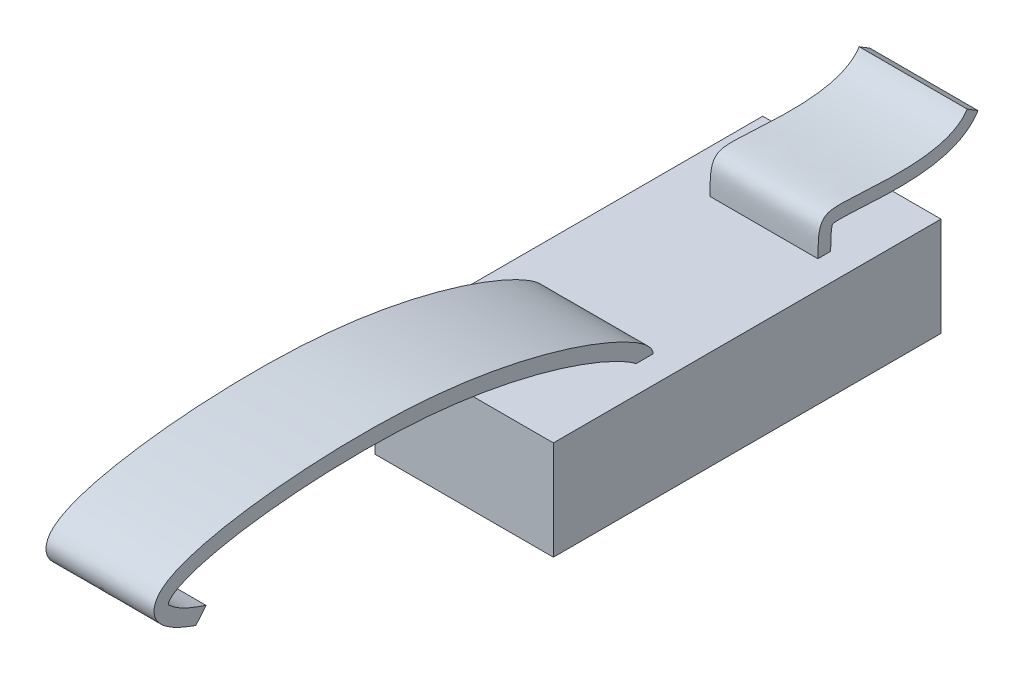
ISO-10303-21;
HEADER;
FILE_DESCRIPTION(('STEP AP214'),'2;1');
FILE_NAME('part.step','',(''),(''),'','','');
FILE_SCHEMA(('AUTOMOTIVE_DESIGN { 1 0 10303 214 1 1 1 1 }'));
ENDSEC;
DATA;
#1=APPLICATION_CONTEXT('core data for automotive mechanical design processes');
#2=APPLICATION_PROTOCOL_DEFINITION('international standard','automotive_design',2000,#1);
#3=PRODUCT_CONTEXT('',#1,'mechanical');
#4=PRODUCT('Part','Part','',(#3));
#5=PRODUCT_RELATED_PRODUCT_CATEGORY('part','',(#4));
#6=PRODUCT_DEFINITION_FORMATION('','',#4);
#7=PRODUCT_DEFINITION_CONTEXT('part definition',#1,'design');
#8=PRODUCT_DEFINITION('design','',#6,#7);
#9=PRODUCT_DEFINITION_SHAPE('','',#8);
#10=(LENGTH_UNIT() NAMED_UNIT(*) SI_UNIT(.MILLI.,.METRE.));
#11=(NAMED_UNIT(*) PLANE_ANGLE_UNIT() SI_UNIT($,.RADIAN.));
#12=(NAMED_UNIT(*) SI_UNIT($,.STERADIAN.) SOLID_ANGLE_UNIT());
#13=UNCERTAINTY_MEASURE_WITH_UNIT(LENGTH_MEASURE(1.E-05),#10,'distance_accuracy_value','');
#14=(GEOMETRIC_REPRESENTATION_CONTEXT(3) GLOBAL_UNCERTAINTY_ASSIGNED_CONTEXT((#13)) GLOBAL_UNIT_ASSIGNED_CONTEXT((#10,
#11,#12)) REPRESENTATION_CONTEXT('',''));
#15=CARTESIAN_POINT('',(0.,0.,0.));
#16=DIRECTION('',(0.,0.,1.));
#17=DIRECTION('',(1.,0.,0.));
#18=AXIS2_PLACEMENT_3D('',#15,#16,#17);
#19=CARTESIAN_POINT('',(-5.36962025316455,7.,-6.77848101265823));
#20=DIRECTION('',(1.,0.,0.));
#21=DIRECTION('',(0.,0.,-1.));
#22=AXIS2_PLACEMENT_3D('',#19,#20,#21);
#23=PLANE('',#22);
#24=DIRECTION('',(0.,0.,1.));
#25=VECTOR('',#24,1.);
#26=CARTESIAN_POINT('',(-5.36962025316455,0.,-6.77848101265823));
#27=LINE('',#26,#25);
#28=CARTESIAN_POINT('',(-5.36962025316455,0.,-6.77848101265823));
#29=VERTEX_POINT('',#28);
#30=CARTESIAN_POINT('',(-5.36962025316455,0.,20.6215189873418));
#31=VERTEX_POINT('',#30);
#32=EDGE_CURVE('E240',#29,#31,#27,.T.);
#33=ORIENTED_EDGE('',*,*,#32,.T.);
#34=DIRECTION('',(0.,-1.,0.));
#35=VECTOR('',#34,1.);
#36=CARTESIAN_POINT('',(-5.36962025316455,7.,20.6215189873418));
#37=LINE('',#36,#35);
#38=CARTESIAN_POINT('',(-5.36962025316455,7.,20.6215189873418));
#39=VERTEX_POINT('',#38);
#40=EDGE_CURVE('E267',#39,#31,#37,.T.);
#41=ORIENTED_EDGE('',*,*,#40,.F.);
#42=DIRECTION('',(0.,0.,1.));
#43=VECTOR('',#42,1.);
#44=CARTESIAN_POINT('',(-5.36962025316455,7.,-6.77848101265823));
#45=LINE('',#44,#43);
#46=CARTESIAN_POINT('',(-5.36962025316455,7.,-6.77848101265823));
#47=VERTEX_POINT('',#46);
#48=EDGE_CURVE('E241',#47,#39,#45,.T.);
#49=ORIENTED_EDGE('',*,*,#48,.F.);
#50=DIRECTION('',(0.,-1.,0.));
#51=VECTOR('',#50,1.);
#52=CARTESIAN_POINT('',(-5.36962025316455,7.,-6.77848101265823));
#53=LINE('',#52,#51);
#54=EDGE_CURVE('E251',#47,#29,#53,.T.);
#55=ORIENTED_EDGE('',*,*,#54,.T.);
#56=EDGE_LOOP('',(#33,#41,#49,#55));
#57=FACE_BOUND('',#56,.T.);
#58=ADVANCED_FACE('F33',(#57),#23,.F.);
#59=CARTESIAN_POINT('',(-5.36962025316455,7.,20.6215189873418));
#60=DIRECTION('',(0.,0.,-1.));
#61=DIRECTION('',(-1.,0.,0.));
#62=AXIS2_PLACEMENT_3D('',#59,#60,#61);
#63=PLANE('',#62);
#64=DIRECTION('',(1.,0.,0.));
#65=VECTOR('',#64,1.);
#66=CARTESIAN_POINT('',(-5.36962025316455,0.,20.6215189873418));
#67=LINE('',#66,#65);
#68=CARTESIAN_POINT('',(7.23037974683545,0.,20.6215189873418));
#69=VERTEX_POINT('',#68);
#70=EDGE_CURVE('E254',#31,#69,#67,.T.);
#71=ORIENTED_EDGE('',*,*,#70,.T.);
#72=DIRECTION('',(0.,-1.,0.));
#73=VECTOR('',#72,1.);
#74=CARTESIAN_POINT('',(7.23037974683545,7.,20.6215189873418));
#75=LINE('',#74,#73);
#76=CARTESIAN_POINT('',(7.23037974683545,7.,20.6215189873418));
#77=VERTEX_POINT('',#76);
#78=EDGE_CURVE('E264',#77,#69,#75,.T.);
#79=ORIENTED_EDGE('',*,*,#78,.F.);
#80=DIRECTION('',(1.,0.,0.));
#81=VECTOR('',#80,1.);
#82=CARTESIAN_POINT('',(-5.36962025316455,7.,20.6215189873418));
#83=LINE('',#82,#81);
#84=EDGE_CURVE('E244',#39,#77,#83,.T.);
#85=ORIENTED_EDGE('',*,*,#84,.F.);
#86=ORIENTED_EDGE('',*,*,#40,.T.);
#87=EDGE_LOOP('',(#71,#79,#85,#86));
#88=FACE_BOUND('',#87,.T.);
#89=ADVANCED_FACE('F304',(#88),#63,.F.);
#90=CARTESIAN_POINT('',(7.23037974683545,7.,-6.77848101265823));
#91=DIRECTION('',(-1.,0.,0.));
#92=DIRECTION('',(0.,0.,1.));
#93=AXIS2_PLACEMENT_3D('',#90,#91,#92);
#94=PLANE('',#93);
#95=DIRECTION('',(0.,0.,-1.));
#96=VECTOR('',#95,1.);
#97=CARTESIAN_POINT('',(7.23037974683545,0.,-6.77848101265823));
#98=LINE('',#97,#96);
#99=CARTESIAN_POINT('',(7.23037974683545,0.,-6.77848101265823));
#100=VERTEX_POINT('',#99);
#101=EDGE_CURVE('E256',#69,#100,#98,.T.);
#102=ORIENTED_EDGE('',*,*,#101,.T.);
#103=DIRECTION('',(0.,-1.,0.));
#104=VECTOR('',#103,1.);
#105=CARTESIAN_POINT('',(7.23037974683545,7.,-6.77848101265823));
#106=LINE('',#105,#104);
#107=CARTESIAN_POINT('',(7.23037974683545,7.,-6.77848101265823));
#108=VERTEX_POINT('',#107);
#109=EDGE_CURVE('E261',#108,#100,#106,.T.);
#110=ORIENTED_EDGE('',*,*,#109,.F.);
#111=DIRECTION('',(0.,0.,-1.));
#112=VECTOR('',#111,1.);
#113=CARTESIAN_POINT('',(7.23037974683545,7.,-6.77848101265823));
#114=LINE('',#113,#112);
#115=EDGE_CURVE('E247',#77,#108,#114,.T.);
#116=ORIENTED_EDGE('',*,*,#115,.F.);
#117=ORIENTED_EDGE('',*,*,#78,.T.);
#118=EDGE_LOOP('',(#102,#110,#116,#117));
#119=FACE_BOUND('',#118,.T.);
#120=ADVANCED_FACE('F309',(#119),#94,.F.);
#121=CARTESIAN_POINT('',(-5.36962025316455,7.,-6.77848101265823));
#122=DIRECTION('',(0.,0.,1.));
#123=DIRECTION('',(1.,0.,0.));
#124=AXIS2_PLACEMENT_3D('',#121,#122,#123);
#125=PLANE('',#124);
#126=DIRECTION('',(-1.,0.,0.));
#127=VECTOR('',#126,1.);
#128=CARTESIAN_POINT('',(-5.36962025316455,0.,-6.77848101265823));
#129=LINE('',#128,#127);
#130=EDGE_CURVE('E245',#100,#29,#129,.T.);
#131=ORIENTED_EDGE('',*,*,#130,.T.);
#132=ORIENTED_EDGE('',*,*,#54,.F.);
#133=DIRECTION('',(-1.,0.,0.));
#134=VECTOR('',#133,1.);
#135=CARTESIAN_POINT('',(-5.36962025316455,7.,-6.77848101265823));
#136=LINE('',#135,#134);
#137=EDGE_CURVE('E249',#108,#47,#136,.T.);
#138=ORIENTED_EDGE('',*,*,#137,.F.);
#139=ORIENTED_EDGE('',*,*,#109,.T.);
#140=EDGE_LOOP('',(#131,#132,#138,#139));
#141=FACE_BOUND('',#140,.T.);
#142=ADVANCED_FACE('F294',(#141),#125,.F.);
#143=CARTESIAN_POINT('',(0.,7.,0.));
#144=DIRECTION('',(0.,1.,0.));
#145=DIRECTION('',(0.,0.,1.));
#146=AXIS2_PLACEMENT_3D('',#143,#144,#145);
#147=PLANE('',#146);
#148=DIRECTION('',(0.,0.,-1.));
#149=VECTOR('',#148,1.);
#150=CARTESIAN_POINT('',(5.30563445315124,7.,0.));
#151=LINE('',#150,#149);
#152=CARTESIAN_POINT('',(5.30563445315124,7.,0.));
#153=VERTEX_POINT('',#152);
#154=CARTESIAN_POINT('',(5.30563445315124,7.,-0.900000000000001));
#155=VERTEX_POINT('',#154);
#156=EDGE_CURVE('E122',#153,#155,#151,.T.);
#157=ORIENTED_EDGE('',*,*,#156,.F.);
#158=DIRECTION('',(1.,0.,0.));
#159=VECTOR('',#158,1.);
#160=CARTESIAN_POINT('',(5.30563445315124,7.,0.));
#161=LINE('',#160,#159);
#162=CARTESIAN_POINT('',(-2.32996765976168,7.,0.));
#163=VERTEX_POINT('',#162);
#164=EDGE_CURVE('E126',#163,#153,#161,.T.);
#165=ORIENTED_EDGE('',*,*,#164,.F.);
#166=DIRECTION('',(0.,0.,1.));
#167=VECTOR('',#166,1.);
#168=CARTESIAN_POINT('',(-2.32996765976168,7.,0.));
#169=LINE('',#168,#167);
#170=CARTESIAN_POINT('',(-2.32996765976168,7.,-0.9));
#171=VERTEX_POINT('',#170);
#172=EDGE_CURVE('E52',#171,#163,#169,.T.);
#173=ORIENTED_EDGE('',*,*,#172,.F.);
#174=DIRECTION('',(-1.,0.,0.));
#175=VECTOR('',#174,1.);
#176=CARTESIAN_POINT('',(5.30563445315124,7.,-0.900000000000001));
#177=LINE('',#176,#175);
#178=EDGE_CURVE('E47',#155,#171,#177,.T.);
#179=ORIENTED_EDGE('',*,*,#178,.F.);
#180=EDGE_LOOP('',(#157,#165,#173,#179));
#181=FACE_BOUND('',#180,.T.);
#182=DIRECTION('',(0.,0.,1.));
#183=VECTOR('',#182,1.);
#184=CARTESIAN_POINT('',(-2.32996765976168,7.,0.));
#185=LINE('',#184,#183);
#186=CARTESIAN_POINT('',(-2.32996765976168,7.,11.641229401083));
#187=VERTEX_POINT('',#186);
#188=CARTESIAN_POINT('',(-2.32996765976174,7.00000000000002,12.8482616948308));
#189=VERTEX_POINT('',#188);
#190=EDGE_CURVE('E11',#187,#189,#185,.T.);
#191=ORIENTED_EDGE('',*,*,#190,.F.);
#192=DIRECTION('',(-1.,0.,0.));
#193=VECTOR('',#192,1.);
#194=CARTESIAN_POINT('',(5.30563445315124,7.,11.641229401083));
#195=LINE('',#194,#193);
#196=CARTESIAN_POINT('',(5.30563445315124,7.,11.641229401083));
#197=VERTEX_POINT('',#196);
#198=EDGE_CURVE('E171',#197,#187,#195,.T.);
#199=ORIENTED_EDGE('',*,*,#198,.F.);
#200=DIRECTION('',(0.,0.,1.));
#201=VECTOR('',#200,1.);
#202=CARTESIAN_POINT('',(5.30563445315124,7.,0.));
#203=LINE('',#202,#201);
#204=CARTESIAN_POINT('',(5.30563445315124,7.,12.8482616980623));
#205=VERTEX_POINT('',#204);
#206=EDGE_CURVE('E270',#205,#197,#203,.F.);
#207=ORIENTED_EDGE('',*,*,#206,.F.);
#208=DIRECTION('',(1.,0.,0.));
#209=VECTOR('',#208,1.);
#210=CARTESIAN_POINT('',(1.48783339669472,7.,12.8482616948307));
#211=LINE('',#210,#209);
#212=EDGE_CURVE('E40',#189,#205,#211,.T.);
#213=ORIENTED_EDGE('',*,*,#212,.F.);
#214=EDGE_LOOP('',(#191,#199,#207,#213));
#215=FACE_BOUND('',#214,.T.);
#216=ORIENTED_EDGE('',*,*,#48,.T.);
#217=ORIENTED_EDGE('',*,*,#84,.T.);
#218=ORIENTED_EDGE('',*,*,#115,.T.);
#219=ORIENTED_EDGE('',*,*,#137,.T.);
#220=EDGE_LOOP('',(#216,#217,#218,#219));
#221=FACE_BOUND('',#220,.T.);
#222=ADVANCED_FACE('F124',(#181,#215,#221),#147,.T.);
#223=CARTESIAN_POINT('',(0.,0.,0.));
#224=DIRECTION('',(0.,1.,0.));
#225=DIRECTION('',(0.,0.,1.));
#226=AXIS2_PLACEMENT_3D('',#223,#224,#225);
#227=PLANE('',#226);
#228=ORIENTED_EDGE('',*,*,#32,.F.);
#229=ORIENTED_EDGE('',*,*,#130,.F.);
#230=ORIENTED_EDGE('',*,*,#101,.F.);
#231=ORIENTED_EDGE('',*,*,#70,.F.);
#232=EDGE_LOOP('',(#228,#229,#230,#231));
#233=FACE_BOUND('',#232,.T.);
#234=ADVANCED_FACE('F293',(#233),#227,.F.);
#235=CARTESIAN_POINT('',(0.,-2.41823993435458,51.4097159470032));
#236=DIRECTION('',(0.,0.639280002311171,0.768974042894186));
#237=DIRECTION('',(0.,-0.768974042894186,0.639280002311171));
#238=AXIS2_PLACEMENT_3D('',#235,#236,#237);
#239=PLANE('',#238);
#240=DIRECTION('',(0.,-0.768974042894186,0.639280002311171));
#241=VECTOR('',#240,1.);
#242=CARTESIAN_POINT('',(5.30563445315125,6.53356330245491,43.967710788574));
#243=LINE('',#242,#241);
#244=CARTESIAN_POINT('',(5.30563445315125,7.40343678201082,43.2445489014342));
#245=VERTEX_POINT('',#244);
#246=CARTESIAN_POINT('',(5.30563445315125,6.53356330245491,43.967710788574));
#247=VERTEX_POINT('',#246);
#248=EDGE_CURVE('E221',#245,#247,#243,.T.);
#249=ORIENTED_EDGE('',*,*,#248,.T.);
#250=DIRECTION('',(-1.,0.,0.));
#251=VECTOR('',#250,1.);
#252=CARTESIAN_POINT('',(5.30563445315125,6.53356330245491,43.967710788574));
#253=LINE('',#252,#251);
#254=CARTESIAN_POINT('',(-2.32996765976167,6.5335633024549,43.967710788574));
#255=VERTEX_POINT('',#254);
#256=EDGE_CURVE('E229',#247,#255,#253,.T.);
#257=ORIENTED_EDGE('',*,*,#256,.T.);
#258=DIRECTION('',(0.,0.768974042894186,-0.639280002311171));
#259=VECTOR('',#258,1.);
#260=CARTESIAN_POINT('',(-2.32996765976167,6.5335633024549,43.967710788574));
#261=LINE('',#260,#259);
#262=CARTESIAN_POINT('',(-2.32996765976167,7.40343678201082,43.2445489014342));
#263=VERTEX_POINT('',#262);
#264=EDGE_CURVE('E195',#255,#263,#261,.T.);
#265=ORIENTED_EDGE('',*,*,#264,.T.);
#266=DIRECTION('',(1.,0.,0.));
#267=VECTOR('',#266,1.);
#268=CARTESIAN_POINT('',(5.30563445315125,7.40343678201082,43.2445489014342));
#269=LINE('',#268,#267);
#270=EDGE_CURVE('E201',#263,#245,#269,.T.);
#271=ORIENTED_EDGE('',*,*,#270,.T.);
#272=EDGE_LOOP('',(#249,#257,#265,#271));
#273=FACE_BOUND('',#272,.T.);
#274=ADVANCED_FACE('F284',(#273),#239,.F.);
#275=CARTESIAN_POINT('',(-2.32996765976168,7.,11.641229401083));
#276=DIRECTION('',(-1.,0.,0.));
#277=DIRECTION('',(0.,0.,1.));
#278=AXIS2_PLACEMENT_3D('',#275,#276,#277);
#279=PLANE('',#278);
#280=CARTESIAN_POINT('',(-2.32996765976168,7.,11.641229401083));
#281=CARTESIAN_POINT('',(-2.32996765976185,7.35180091968286,11.687529660842));
#282=CARTESIAN_POINT('',(-2.32996765976168,7.56188775802542,11.8952930494612));
#283=CARTESIAN_POINT('',(-2.32996765976168,8.01115716450498,12.4118987048412));
#284=CARTESIAN_POINT('',(-2.32996765976148,8.23557758705379,12.7502201975191));
#285=CARTESIAN_POINT('',(-2.32996765976207,8.94123316981016,14.0013591494166));
#286=CARTESIAN_POINT('',(-2.32996765976232,9.44945055369038,15.150697196849));
#287=CARTESIAN_POINT('',(-2.3299676597604,10.9366553342616,19.4055325324583));
#288=CARTESIAN_POINT('',(-2.32996765976265,11.8715393897896,23.3149369612656));
#289=CARTESIAN_POINT('',(-2.32996765976065,12.5834385736365,32.6379012885933));
#290=CARTESIAN_POINT('',(-2.32996765975841,12.283151964757,38.0734337228881));
#291=CARTESIAN_POINT('',(-2.32996765976249,11.3965391658568,42.7861079631615));
#292=CARTESIAN_POINT('',(-2.32996765976167,11.1937463448223,43.6249638149558));
#293=CARTESIAN_POINT('',(-2.32996765976167,10.7390429586087,45.0425529568409));
#294=CARTESIAN_POINT('',(-2.32996765976167,10.4949299973695,45.6177128652415));
#295=CARTESIAN_POINT('',(-2.32996765976167,10.0371821645438,46.299824760526));
#296=CARTESIAN_POINT('',(-2.32996765976174,9.86735256543793,46.5026417537848));
#297=CARTESIAN_POINT('',(-2.3299676597616,9.42455789547027,46.8254496224969));
#298=CARTESIAN_POINT('',(-2.32996765976164,9.13634681562368,46.9346218279824));
#299=CARTESIAN_POINT('',(-2.32996765976171,8.55795445052203,46.9157117342475));
#300=CARTESIAN_POINT('',(-2.32996765976172,8.2904052315245,46.7996543788313));
#301=CARTESIAN_POINT('',(-2.32996765976163,7.82937900313348,46.4480228507235));
#302=CARTESIAN_POINT('',(-2.32996765976174,7.62625173240319,46.2113072668003));
#303=CARTESIAN_POINT('',(-2.32996765976158,7.15765097978176,45.5021460487176));
#304=CARTESIAN_POINT('',(-2.32996765976234,6.88849863816519,44.9542261396919));
#305=CARTESIAN_POINT('',(-2.32996765976167,6.5335633024549,43.967710788574));
#306=B_SPLINE_CURVE_WITH_KNOTS('',3,(#280,#281,#282,#283,#284,#285,#286,#287,#288,#289,#290,
#291,#292,#293,#294,#295,#296,#297,#298,#299,#300,#301,#302,#303,#304,#305),.UNSPECIFIED.,.F.,
.F.,(4,2,2,2,2,2,2,2,2,2,2,2,4),(0.,0.0582775059626275,0.116555011925255,0.23311002385051,
0.46622004770102,0.711584879233079,0.772926087116093,0.834267294999108,0.864937898940616,
0.895608502882123,0.92627910682363,0.956949710765138,1.),.UNSPECIFIED.);
#307=EDGE_CURVE('E208',#187,#255,#306,.T.);
#308=ORIENTED_EDGE('',*,*,#307,.F.);
#309=ORIENTED_EDGE('',*,*,#190,.T.);
#310=CARTESIAN_POINT('',(-2.32996765976168,7.,12.7724424603457));
#311=CARTESIAN_POINT('',(-2.32996765976182,6.94068130002372,12.8108686523083));
#312=CARTESIAN_POINT('',(-2.32996765976168,7.04988737371186,12.9084491507833));
#313=CARTESIAN_POINT('',(-2.32996765976168,7.33767240946731,13.3257083339261));
#314=CARTESIAN_POINT('',(-2.32996765976158,7.52334421434966,13.630158131661));
#315=CARTESIAN_POINT('',(-2.32996765976188,8.1299969955016,14.7946028090413));
#316=CARTESIAN_POINT('',(-2.32996765976232,8.60529650062281,15.905393659621));
#317=CARTESIAN_POINT('',(-2.3299676597604,9.99720613232932,20.0436214808578));
#318=CARTESIAN_POINT('',(-2.32996765976265,10.8855843960509,23.8794342279068));
#319=CARTESIAN_POINT('',(-2.32996765976065,11.5078332226011,33.0053759222553));
#320=CARTESIAN_POINT('',(-2.32996765975841,11.1905324491739,38.4014031839591));
#321=CARTESIAN_POINT('',(-2.32996765976249,10.274192837846,42.9321913447023));
#322=CARTESIAN_POINT('',(-2.32996765976167,10.0648592555074,43.7272837413915));
#323=CARTESIAN_POINT('',(-2.32996765976167,9.60630756602575,45.0005297231792));
#324=CARTESIAN_POINT('',(-2.32996765976177,9.3503450453756,45.4817740837144));
#325=CARTESIAN_POINT('',(-2.32996765976162,8.99420194136412,45.8480915204045));
#326=CARTESIAN_POINT('',(-2.32996765976174,8.88183697784206,45.9061379168218));
#327=CARTESIAN_POINT('',(-2.3299676597616,8.73090413001233,45.9057205533566));
#328=CARTESIAN_POINT('',(-2.32996765976161,8.70552302453558,45.8566142953047));
#329=CARTESIAN_POINT('',(-2.32996765976174,8.64278457579462,45.7579061430257));
#330=CARTESIAN_POINT('',(-2.32996765976172,8.58585199018212,45.6979035448943));
#331=CARTESIAN_POINT('',(-2.32996765976163,8.39596685898419,45.4580116845335));
#332=CARTESIAN_POINT('',(-2.32996765976174,8.27136115743349,45.2791097534338));
#333=CARTESIAN_POINT('',(-2.32996765976158,7.94257698080262,44.6809271277438));
#334=CARTESIAN_POINT('',(-2.3299676597628,7.73655485504607,44.210099992283));
#335=CARTESIAN_POINT('',(-2.32996765976167,7.40343678201082,43.2445489014342));
#336=B_SPLINE_CURVE_WITH_KNOTS('',3,(#310,#311,#312,#313,#314,#315,#316,#317,#318,#319,#320,
#321,#322,#323,#324,#325,#326,#327,#328,#329,#330,#331,#332,#333,#334,#335),.UNSPECIFIED.,.F.,
.F.,(4,2,2,2,2,2,2,2,2,2,2,2,4),(0.,0.0582775059626275,0.116555011925255,0.23311002385051,
0.46622004770102,0.711584879233079,0.772926087116093,0.834267294999108,0.864937898940616,
0.895608502882123,0.92627910682363,0.956949710765138,1.),.UNSPECIFIED.);
#337=EDGE_CURVE('E203',#189,#263,#336,.T.);
#338=ORIENTED_EDGE('',*,*,#337,.T.);
#339=ORIENTED_EDGE('',*,*,#264,.F.);
#340=EDGE_LOOP('',(#308,#309,#338,#339));
#341=FACE_BOUND('',#340,.T.);
#342=ADVANCED_FACE('F290',(#341),#279,.T.);
#343=CARTESIAN_POINT('',(-2.32996765976168,7.,12.7724424603457));
#344=CARTESIAN_POINT('',(-2.32996765976182,6.94068130002372,12.8108686523083));
#345=CARTESIAN_POINT('',(-2.32996765976168,7.04988737371186,12.9084491507833));
#346=CARTESIAN_POINT('',(-2.32996765976168,7.33767240946731,13.3257083339261));
#347=CARTESIAN_POINT('',(-2.32996765976158,7.52334421434966,13.630158131661));
#348=CARTESIAN_POINT('',(-2.32996765976187,8.1299969955016,14.7946028090413));
#349=CARTESIAN_POINT('',(-2.32996765976232,8.60529650062281,15.905393659621));
#350=CARTESIAN_POINT('',(-2.3299676597604,9.99720613232932,20.0436214808578));
#351=CARTESIAN_POINT('',(-2.32996765976265,10.8855843960509,23.8794342279068));
#352=CARTESIAN_POINT('',(-2.32996765976065,11.5078332226011,33.0053759222553));
#353=CARTESIAN_POINT('',(-2.32996765975841,11.1905324491739,38.4014031839591));
#354=CARTESIAN_POINT('',(-2.32996765976249,10.274192837846,42.9321913447023));
#355=CARTESIAN_POINT('',(-2.32996765976167,10.0648592555074,43.7272837413915));
#356=CARTESIAN_POINT('',(-2.32996765976167,9.60630756602575,45.0005297231792));
#357=CARTESIAN_POINT('',(-2.32996765976176,9.3503450453756,45.4817740837144));
#358=CARTESIAN_POINT('',(-2.32996765976162,8.99420194136412,45.8480915204045));
#359=CARTESIAN_POINT('',(-2.32996765976174,8.88183697784206,45.9061379168218));
#360=CARTESIAN_POINT('',(-2.3299676597616,8.73090413001233,45.9057205533566));
#361=CARTESIAN_POINT('',(-2.32996765976161,8.70552302453558,45.8566142953047));
#362=CARTESIAN_POINT('',(-2.32996765976174,8.64278457579462,45.7579061430257));
#363=CARTESIAN_POINT('',(-2.32996765976172,8.58585199018212,45.6979035448943));
#364=CARTESIAN_POINT('',(-2.32996765976163,8.39596685898419,45.4580116845335));
#365=CARTESIAN_POINT('',(-2.32996765976174,8.27136115743349,45.2791097534338));
#366=CARTESIAN_POINT('',(-2.32996765976158,7.94257698080262,44.6809271277438));
#367=CARTESIAN_POINT('',(-2.3299676597628,7.73655485504607,44.210099992283));
#368=CARTESIAN_POINT('',(-2.32996765976167,7.40343678201082,43.2445489014342));
#369=CARTESIAN_POINT('',(5.30563445315124,7.,12.7724424603457));
#370=CARTESIAN_POINT('',(5.3056344531511,6.94068130002363,12.8108686523083));
#371=CARTESIAN_POINT('',(5.30563445315124,7.04988737371186,12.9084491507831));
#372=CARTESIAN_POINT('',(5.30563445315124,7.33767240946731,13.3257083339264));
#373=CARTESIAN_POINT('',(5.30563445315124,7.52334421435045,13.6301581316614));
#374=CARTESIAN_POINT('',(5.30563445315124,8.12999699550002,14.7946028090405));
#375=CARTESIAN_POINT('',(5.3056344531506,8.60529650062409,15.905393659621));
#376=CARTESIAN_POINT('',(5.30563445315252,9.99720613232675,20.0436214808578));
#377=CARTESIAN_POINT('',(5.30563445315124,10.8855843960509,23.8794342279068));
#378=CARTESIAN_POINT('',(5.30563445315124,11.5078332226011,33.0053759222553));
#379=CARTESIAN_POINT('',(5.30563445315451,11.1905324491771,38.4014031839721));
#380=CARTESIAN_POINT('',(5.30563445315043,10.2741928378452,42.932191344699));
#381=CARTESIAN_POINT('',(5.30563445315125,10.0648592555074,43.7272837413915));
#382=CARTESIAN_POINT('',(5.30563445315125,9.60630756602575,45.0005297231792));
#383=CARTESIAN_POINT('',(5.30563445315106,9.35034504537485,45.4817740837129));
#384=CARTESIAN_POINT('',(5.30563445315134,8.9942019413645,45.8480915204052));
#385=CARTESIAN_POINT('',(5.30563445315118,8.88183697784206,45.9061379168218));
#386=CARTESIAN_POINT('',(5.30563445315132,8.73090413001233,45.9057205533566));
#387=CARTESIAN_POINT('',(5.30563445315131,8.70552302453598,45.8566142953042));
#388=CARTESIAN_POINT('',(5.30563445315118,8.64278457579422,45.7579061430263));
#389=CARTESIAN_POINT('',(5.30563445315125,8.58585199018194,45.697903544895));
#390=CARTESIAN_POINT('',(5.30563445315125,8.39596685898438,45.4580116845328));
#391=CARTESIAN_POINT('',(5.30563445315125,8.27136115743322,45.2791097534327));
#392=CARTESIAN_POINT('',(5.30563445315125,7.94257698080301,44.6809271277454));
#393=CARTESIAN_POINT('',(5.30563445314989,7.73655485504176,44.2100999922832));
#394=CARTESIAN_POINT('',(5.30563445315125,7.40343678201082,43.2445489014342));
#395=B_SPLINE_SURFACE_WITH_KNOTS('',1,3,((#343,#344,#345,#346,#347,#348,#349,#350,#351,#352,
#353,#354,#355,#356,#357,#358,#359,#360,#361,#362,#363,#364,#365,#366,#367,#368),(#369,#370,
#371,#372,#373,#374,#375,#376,#377,#378,#379,#380,#381,#382,#383,#384,#385,#386,#387,#388,#389,
#390,#391,#392,#393,#394)),.UNSPECIFIED.,.F.,.F.,.F.,(2,2),(4,2,2,2,2,2,2,2,2,2,2,2,4),(0.,1.),
(0.,0.0582775059626275,0.116555011925255,0.23311002385051,0.46622004770102,0.711584879233079,
0.772926087116093,0.834267294999108,0.864937898940616,0.895608502882123,0.92627910682363,
0.956949710765138,1.),.UNSPECIFIED.);
#396=CARTESIAN_POINT('',(5.30563445315124,7.,12.7724424603457));
#397=CARTESIAN_POINT('',(5.3056344531511,6.94068130002363,12.8108686523083));
#398=CARTESIAN_POINT('',(5.30563445315124,7.04988737371186,12.9084491507831));
#399=CARTESIAN_POINT('',(5.30563445315124,7.33767240946731,13.3257083339264));
#400=CARTESIAN_POINT('',(5.30563445315124,7.52334421435045,13.6301581316614));
#401=CARTESIAN_POINT('',(5.30563445315124,8.12999699550002,14.7946028090405));
#402=CARTESIAN_POINT('',(5.3056344531506,8.60529650062409,15.905393659621));
#403=CARTESIAN_POINT('',(5.30563445315252,9.99720613232675,20.0436214808578));
#404=CARTESIAN_POINT('',(5.30563445315124,10.8855843960509,23.8794342279068));
#405=CARTESIAN_POINT('',(5.30563445315124,11.5078332226011,33.0053759222553));
#406=CARTESIAN_POINT('',(5.30563445315451,11.1905324491771,38.4014031839721));
#407=CARTESIAN_POINT('',(5.30563445315043,10.2741928378452,42.932191344699));
#408=CARTESIAN_POINT('',(5.30563445315125,10.0648592555074,43.7272837413915));
#409=CARTESIAN_POINT('',(5.30563445315125,9.60630756602575,45.0005297231792));
#410=CARTESIAN_POINT('',(5.30563445315106,9.35034504537485,45.4817740837129));
#411=CARTESIAN_POINT('',(5.30563445315134,8.9942019413645,45.8480915204052));
#412=CARTESIAN_POINT('',(5.30563445315118,8.88183697784206,45.9061379168218));
#413=CARTESIAN_POINT('',(5.30563445315132,8.73090413001233,45.9057205533566));
#414=CARTESIAN_POINT('',(5.30563445315131,8.70552302453598,45.8566142953042));
#415=CARTESIAN_POINT('',(5.30563445315118,8.64278457579422,45.7579061430263));
#416=CARTESIAN_POINT('',(5.30563445315125,8.58585199018194,45.697903544895));
#417=CARTESIAN_POINT('',(5.30563445315125,8.39596685898438,45.4580116845328));
#418=CARTESIAN_POINT('',(5.30563445315125,8.27136115743322,45.2791097534327));
#419=CARTESIAN_POINT('',(5.30563445315125,7.94257698080301,44.6809271277454));
#420=CARTESIAN_POINT('',(5.30563445314989,7.73655485504176,44.2100999922832));
#421=CARTESIAN_POINT('',(5.30563445315125,7.40343678201082,43.2445489014342));
#422=B_SPLINE_CURVE_WITH_KNOTS('',3,(#396,#397,#398,#399,#400,#401,#402,#403,#404,#405,#406,
#407,#408,#409,#410,#411,#412,#413,#414,#415,#416,#417,#418,#419,#420,#421),.UNSPECIFIED.,.F.,
.F.,(4,2,2,2,2,2,2,2,2,2,2,2,4),(0.,0.0582775059626275,0.116555011925255,0.23311002385051,
0.46622004770102,0.711584879233079,0.772926087116093,0.834267294999108,0.864937898940616,
0.895608502882123,0.92627910682363,0.956949710765138,1.),.UNSPECIFIED.);
#423=EDGE_CURVE('E207',#205,#245,#422,.T.);
#424=ORIENTED_EDGE('',*,*,#337,.F.);
#425=ORIENTED_EDGE('',*,*,#212,.T.);
#426=ORIENTED_EDGE('',*,*,#423,.T.);
#427=ORIENTED_EDGE('',*,*,#270,.F.);
#428=EDGE_LOOP('',(#424,#425,#426,#427));
#429=FACE_BOUND('',#428,.T.);
#430=ADVANCED_FACE('F275',(#429),#395,.T.);
#431=CARTESIAN_POINT('',(5.30563445315124,7.,11.641229401083));
#432=DIRECTION('',(-1.,0.,0.));
#433=DIRECTION('',(0.,0.,1.));
#434=AXIS2_PLACEMENT_3D('',#431,#432,#433);
#435=PLANE('',#434);
#436=ORIENTED_EDGE('',*,*,#423,.F.);
#437=ORIENTED_EDGE('',*,*,#206,.T.);
#438=CARTESIAN_POINT('',(5.30563445315124,7.,11.641229401083));
#439=CARTESIAN_POINT('',(5.30563445315107,7.35180091968285,11.687529660842));
#440=CARTESIAN_POINT('',(5.30563445315124,7.56188775802542,11.8952930494612));
#441=CARTESIAN_POINT('',(5.30563445315124,8.01115716450498,12.4118987048412));
#442=CARTESIAN_POINT('',(5.30563445315124,8.23557758705419,12.7502201975195));
#443=CARTESIAN_POINT('',(5.30563445315124,8.94123316980937,14.0013591494158));
#444=CARTESIAN_POINT('',(5.3056344531506,9.44945055369166,15.150697196849));
#445=CARTESIAN_POINT('',(5.30563445315252,10.936655334259,19.4055325324583));
#446=CARTESIAN_POINT('',(5.30563445314929,11.8715393897935,23.3149369612656));
#447=CARTESIAN_POINT('',(5.3056344531533,12.5834385736324,32.6379012885933));
#448=CARTESIAN_POINT('',(5.30563445315451,12.2831519647602,38.0734337228881));
#449=CARTESIAN_POINT('',(5.30563445315043,11.396539165856,42.7861079631615));
#450=CARTESIAN_POINT('',(5.30563445315125,11.1937463448223,43.6249638149558));
#451=CARTESIAN_POINT('',(5.30563445315125,10.7390429586087,45.0425529568409));
#452=CARTESIAN_POINT('',(5.30563445315125,10.4949299973688,45.617712865243));
#453=CARTESIAN_POINT('',(5.30563445315125,10.0371821645442,46.2998247605253));
#454=CARTESIAN_POINT('',(5.30563445315118,9.86735256543779,46.5026417537854));
#455=CARTESIAN_POINT('',(5.30563445315132,9.42455789547041,46.8254496224963));
#456=CARTESIAN_POINT('',(5.30563445315131,9.13634681562407,46.9346218279819));
#457=CARTESIAN_POINT('',(5.30563445315118,8.55795445052162,46.915711734248));
#458=CARTESIAN_POINT('',(5.30563445315125,8.29040523152413,46.7996543788313));
#459=CARTESIAN_POINT('',(5.30563445315125,7.82937900313385,46.4480228507235));
#460=CARTESIAN_POINT('',(5.30563445315138,7.62625173240319,46.2113072668003));
#461=CARTESIAN_POINT('',(5.30563445315105,7.15765097978177,45.5021460487176));
#462=CARTESIAN_POINT('',(5.30563445315035,6.88849863816585,44.9542261396917));
#463=CARTESIAN_POINT('',(5.30563445315125,6.53356330245491,43.967710788574));
#464=B_SPLINE_CURVE_WITH_KNOTS('',3,(#438,#439,#440,#441,#442,#443,#444,#445,#446,#447,#448,
#449,#450,#451,#452,#453,#454,#455,#456,#457,#458,#459,#460,#461,#462,#463),.UNSPECIFIED.,.F.,
.F.,(4,2,2,2,2,2,2,2,2,2,2,2,4),(0.,0.0582775059626275,0.116555011925255,0.23311002385051,
0.46622004770102,0.711584879233079,0.772926087116093,0.834267294999108,0.864937898940616,
0.895608502882123,0.92627910682363,0.956949710765138,1.),.UNSPECIFIED.);
#465=EDGE_CURVE('E202',#197,#247,#464,.T.);
#466=ORIENTED_EDGE('',*,*,#465,.T.);
#467=ORIENTED_EDGE('',*,*,#248,.F.);
#468=EDGE_LOOP('',(#436,#437,#466,#467));
#469=FACE_BOUND('',#468,.T.);
#470=ADVANCED_FACE('F279',(#469),#435,.F.);
#471=CARTESIAN_POINT('',(5.30563445315124,7.,11.641229401083));
#472=CARTESIAN_POINT('',(5.30563445315107,7.35180091968285,11.687529660842));
#473=CARTESIAN_POINT('',(5.30563445315124,7.56188775802542,11.8952930494612));
#474=CARTESIAN_POINT('',(5.30563445315124,8.01115716450498,12.4118987048412));
#475=CARTESIAN_POINT('',(5.30563445315124,8.23557758705419,12.7502201975195));
#476=CARTESIAN_POINT('',(5.30563445315124,8.94123316980937,14.0013591494158));
#477=CARTESIAN_POINT('',(5.3056344531506,9.44945055369166,15.150697196849));
#478=CARTESIAN_POINT('',(5.30563445315252,10.936655334259,19.4055325324583));
#479=CARTESIAN_POINT('',(5.30563445314929,11.8715393897935,23.3149369612656));
#480=CARTESIAN_POINT('',(5.3056344531533,12.5834385736324,32.6379012885933));
#481=CARTESIAN_POINT('',(5.30563445315451,12.2831519647602,38.0734337228881));
#482=CARTESIAN_POINT('',(5.30563445315043,11.396539165856,42.7861079631615));
#483=CARTESIAN_POINT('',(5.30563445315125,11.1937463448223,43.6249638149558));
#484=CARTESIAN_POINT('',(5.30563445315125,10.7390429586087,45.0425529568409));
#485=CARTESIAN_POINT('',(5.30563445315125,10.4949299973688,45.617712865243));
#486=CARTESIAN_POINT('',(5.30563445315125,10.0371821645442,46.2998247605253));
#487=CARTESIAN_POINT('',(5.30563445315118,9.86735256543779,46.5026417537854));
#488=CARTESIAN_POINT('',(5.30563445315132,9.42455789547041,46.8254496224963));
#489=CARTESIAN_POINT('',(5.30563445315131,9.13634681562407,46.9346218279819));
#490=CARTESIAN_POINT('',(5.30563445315118,8.55795445052162,46.915711734248));
#491=CARTESIAN_POINT('',(5.30563445315125,8.29040523152413,46.7996543788313));
#492=CARTESIAN_POINT('',(5.30563445315125,7.82937900313385,46.4480228507235));
#493=CARTESIAN_POINT('',(5.30563445315138,7.62625173240319,46.2113072668003));
#494=CARTESIAN_POINT('',(5.30563445315105,7.15765097978177,45.5021460487176));
#495=CARTESIAN_POINT('',(5.30563445315035,6.88849863816585,44.9542261396917));
#496=CARTESIAN_POINT('',(5.30563445315125,6.53356330245491,43.967710788574));
#497=CARTESIAN_POINT('',(-2.32996765976168,7.,11.641229401083));
#498=CARTESIAN_POINT('',(-2.32996765976185,7.35180091968286,11.687529660842));
#499=CARTESIAN_POINT('',(-2.32996765976168,7.56188775802542,11.8952930494612));
#500=CARTESIAN_POINT('',(-2.32996765976168,8.01115716450498,12.4118987048412));
#501=CARTESIAN_POINT('',(-2.32996765976148,8.23557758705379,12.7502201975191));
#502=CARTESIAN_POINT('',(-2.32996765976207,8.94123316981016,14.0013591494166));
#503=CARTESIAN_POINT('',(-2.32996765976232,9.44945055369038,15.150697196849));
#504=CARTESIAN_POINT('',(-2.32996765976039,10.9366553342616,19.4055325324583));
#505=CARTESIAN_POINT('',(-2.32996765976265,11.8715393897896,23.3149369612656));
#506=CARTESIAN_POINT('',(-2.32996765976065,12.5834385736365,32.6379012885933));
#507=CARTESIAN_POINT('',(-2.32996765975841,12.283151964757,38.0734337228881));
#508=CARTESIAN_POINT('',(-2.32996765976249,11.3965391658568,42.7861079631615));
#509=CARTESIAN_POINT('',(-2.32996765976167,11.1937463448223,43.6249638149558));
#510=CARTESIAN_POINT('',(-2.32996765976167,10.7390429586087,45.0425529568409));
#511=CARTESIAN_POINT('',(-2.32996765976167,10.4949299973695,45.6177128652415));
#512=CARTESIAN_POINT('',(-2.32996765976167,10.0371821645438,46.299824760526));
#513=CARTESIAN_POINT('',(-2.32996765976174,9.86735256543793,46.5026417537848));
#514=CARTESIAN_POINT('',(-2.3299676597616,9.42455789547027,46.8254496224969));
#515=CARTESIAN_POINT('',(-2.32996765976164,9.13634681562368,46.9346218279824));
#516=CARTESIAN_POINT('',(-2.32996765976171,8.55795445052203,46.9157117342475));
#517=CARTESIAN_POINT('',(-2.32996765976172,8.2904052315245,46.7996543788313));
#518=CARTESIAN_POINT('',(-2.32996765976163,7.82937900313348,46.4480228507235));
#519=CARTESIAN_POINT('',(-2.32996765976174,7.62625173240319,46.2113072668003));
#520=CARTESIAN_POINT('',(-2.32996765976158,7.15765097978176,45.5021460487176));
#521=CARTESIAN_POINT('',(-2.32996765976234,6.88849863816519,44.9542261396919));
#522=CARTESIAN_POINT('',(-2.32996765976167,6.5335633024549,43.967710788574));
#523=B_SPLINE_SURFACE_WITH_KNOTS('',1,3,((#471,#472,#473,#474,#475,#476,#477,#478,#479,#480,
#481,#482,#483,#484,#485,#486,#487,#488,#489,#490,#491,#492,#493,#494,#495,#496),(#497,#498,
#499,#500,#501,#502,#503,#504,#505,#506,#507,#508,#509,#510,#511,#512,#513,#514,#515,#516,#517,
#518,#519,#520,#521,#522)),.UNSPECIFIED.,.F.,.F.,.F.,(2,2),(4,2,2,2,2,2,2,2,2,2,2,2,4),(0.,1.),
(0.,0.0582775059626275,0.116555011925255,0.23311002385051,0.46622004770102,0.711584879233079,
0.772926087116093,0.834267294999108,0.864937898940616,0.895608502882123,0.92627910682363,
0.956949710765138,1.),.UNSPECIFIED.);
#524=ORIENTED_EDGE('',*,*,#256,.F.);
#525=ORIENTED_EDGE('',*,*,#465,.F.);
#526=ORIENTED_EDGE('',*,*,#198,.T.);
#527=ORIENTED_EDGE('',*,*,#307,.T.);
#528=EDGE_LOOP('',(#524,#525,#526,#527));
#529=FACE_BOUND('',#528,.T.);
#530=ADVANCED_FACE('F287',(#529),#523,.T.);
#531=CARTESIAN_POINT('',(0.,10.88426966904,-10.5533679980284));
#532=DIRECTION('',(0.,0.850572183181831,-0.52585830905035));
#533=DIRECTION('',(0.,0.52585830905035,0.850572183181831));
#534=AXIS2_PLACEMENT_3D('',#531,#532,#533);
#535=PLANE('',#534);
#536=DIRECTION('',(0.,-0.52585830905035,-0.850572183181831));
#537=VECTOR('',#536,1.);
#538=CARTESIAN_POINT('',(5.30563445315124,10.88426966904,-10.5533679980284));
#539=LINE('',#538,#537);
#540=CARTESIAN_POINT('',(5.30563445315124,10.88426966904,-10.5533679980284));
#541=VERTEX_POINT('',#540);
#542=CARTESIAN_POINT('',(5.30563445315124,10.4109971908947,-11.3188829628921));
#543=VERTEX_POINT('',#542);
#544=EDGE_CURVE('E144',#541,#543,#539,.T.);
#545=ORIENTED_EDGE('',*,*,#544,.T.);
#546=DIRECTION('',(-1.,0.,0.));
#547=VECTOR('',#546,1.);
#548=CARTESIAN_POINT('',(5.30563445315124,10.4109971908947,-11.3188829628921));
#549=LINE('',#548,#547);
#550=CARTESIAN_POINT('',(-2.32996765976168,10.4109971908947,-11.3188829628921));
#551=VERTEX_POINT('',#550);
#552=EDGE_CURVE('E157',#543,#551,#549,.T.);
#553=ORIENTED_EDGE('',*,*,#552,.T.);
#554=DIRECTION('',(0.,0.52585830905035,0.850572183181831));
#555=VECTOR('',#554,1.);
#556=CARTESIAN_POINT('',(-2.32996765976168,10.88426966904,-10.5533679980284));
#557=LINE('',#556,#555);
#558=CARTESIAN_POINT('',(-2.32996765976168,10.88426966904,-10.5533679980284));
#559=VERTEX_POINT('',#558);
#560=EDGE_CURVE('E159',#551,#559,#557,.T.);
#561=ORIENTED_EDGE('',*,*,#560,.T.);
#562=DIRECTION('',(1.,0.,0.));
#563=VECTOR('',#562,1.);
#564=CARTESIAN_POINT('',(5.30563445315124,10.88426966904,-10.5533679980284));
#565=LINE('',#564,#563);
#566=EDGE_CURVE('E162',#559,#541,#565,.T.);
#567=ORIENTED_EDGE('',*,*,#566,.T.);
#568=EDGE_LOOP('',(#545,#553,#561,#567));
#569=FACE_BOUND('',#568,.T.);
#570=ADVANCED_FACE('F321',(#569),#535,.T.);
#571=CARTESIAN_POINT('',(5.30563445315124,7.,0.));
#572=DIRECTION('',(1.,0.,0.));
#573=DIRECTION('',(0.,0.,-1.));
#574=AXIS2_PLACEMENT_3D('',#571,#572,#573);
#575=PLANE('',#574);
#576=CARTESIAN_POINT('',(5.30563445315124,7.,-0.900000000000001));
#577=CARTESIAN_POINT('',(5.30563445314652,7.8957481039347,-0.904692018500044));
#578=CARTESIAN_POINT('',(5.30563445315137,8.39539342137211,-0.959309146840504));
#579=CARTESIAN_POINT('',(5.30563445315122,8.57928207799173,-1.02517924917286));
#580=CARTESIAN_POINT('',(5.30563445315121,8.594374360789,-1.03139918388191));
#581=CARTESIAN_POINT('',(5.30563445315121,8.60206596922445,-1.03499620345877));
#582=B_SPLINE_CURVE_WITH_KNOTS('',3,(#576,#577,#578,#579,#580,#581),.UNSPECIFIED.,.F.,.F.,(4,2,
4),(0.,0.113437863100403,0.13367105953433),.UNSPECIFIED.);
#583=CARTESIAN_POINT('',(5.30563445315121,8.60206596922445,-1.03499620345877));
#584=VERTEX_POINT('',#583);
#585=EDGE_CURVE('E147',#155,#584,#582,.T.);
#586=ORIENTED_EDGE('',*,*,#585,.T.);
#587=CARTESIAN_POINT('',(5.30563445315124,8.60206596784424,-1.03499620133634));
#588=CARTESIAN_POINT('',(5.30563445315124,8.60207482808123,-1.03797989728009));
#589=CARTESIAN_POINT('',(5.30563445315124,8.6173113369085,-1.07643574539169));
#590=CARTESIAN_POINT('',(5.30563445315124,8.67002920430278,-1.53767307342854));
#591=CARTESIAN_POINT('',(5.30563445315086,8.63621877083813,-2.27788913766227));
#592=CARTESIAN_POINT('',(5.30563445315162,8.53724289187674,-4.02819167462551));
#593=CARTESIAN_POINT('',(5.30563445315124,8.47837977763817,-5.05541940639539));
#594=CARTESIAN_POINT('',(5.30563445315124,8.51607995046685,-7.12417316791396));
#595=CARTESIAN_POINT('',(5.30563445315163,8.61016543489054,-8.16598193258507));
#596=CARTESIAN_POINT('',(5.30563445315085,9.15889998785145,-10.0079108280072));
#597=CARTESIAN_POINT('',(5.30563445315124,9.61726785307196,-10.8233716418807));
#598=CARTESIAN_POINT('',(5.30563445315124,10.4109971908947,-11.3188829628921));
#599=B_SPLINE_CURVE_WITH_KNOTS('',3,(#587,#588,#589,#590,#591,#592,#593,#594,#595,#596,#597,
#598),.UNSPECIFIED.,.F.,.F.,(4,2,2,2,2,4),(0.176410654957372,0.226875726200806,
0.420156794650604,0.613437863100403,0.806718931550201,1.),.UNSPECIFIED.);
#600=EDGE_CURVE('E145',#584,#543,#599,.T.);
#601=ORIENTED_EDGE('',*,*,#600,.T.);
#602=ORIENTED_EDGE('',*,*,#544,.F.);
#603=CARTESIAN_POINT('',(5.30563445315124,7.,0.));
#604=CARTESIAN_POINT('',(5.30563445314646,7.92964959856126,-0.00475587164856414));
#605=CARTESIAN_POINT('',(5.30563445315137,8.43710495641774,-0.0209688925437325));
#606=CARTESIAN_POINT('',(5.30563445315118,9.05194222035297,-0.237195582479605));
#607=CARTESIAN_POINT('',(5.30563445315124,9.24673025137005,-0.371049114052464));
#608=CARTESIAN_POINT('',(5.30563445315124,9.47494703458566,-0.729592493220167));
#609=CARTESIAN_POINT('',(5.30563445315124,9.50361366360397,-0.908216918187412));
#610=CARTESIAN_POINT('',(5.30563445315124,9.58349882247509,-1.59510642878459));
#611=CARTESIAN_POINT('',(5.30563445315086,9.53504829915586,-2.32377545144306));
#612=CARTESIAN_POINT('',(5.30563445315162,9.43604437061471,-4.07462416971886));
#613=CARTESIAN_POINT('',(5.30563445315124,9.37918841049401,-5.07966266865972));
#614=CARTESIAN_POINT('',(5.30563445315124,9.414783381606,-7.0580212963134));
#615=CARTESIAN_POINT('',(5.30563445315163,9.50971207506152,-8.03105875953757));
#616=CARTESIAN_POINT('',(5.30563445315085,9.98193072158438,-9.6206011115175));
#617=CARTESIAN_POINT('',(5.30563445315124,10.3554979066485,-10.2217857101645));
#618=CARTESIAN_POINT('',(5.30563445315124,10.88426966904,-10.5533679980284));
#619=B_SPLINE_CURVE_WITH_KNOTS('',3,(#603,#604,#605,#606,#607,#608,#609,#610,#611,#612,#613,
#614,#615,#616,#617,#618),.UNSPECIFIED.,.F.,.F.,(4,2,2,2,2,2,2,4),(0.,0.113437863100403,
0.170156794650604,0.226875726200806,0.420156794650604,0.613437863100403,0.806718931550201,1.),.UNSPECIFIED.);
#620=EDGE_CURVE('E137',#153,#541,#619,.T.);
#621=ORIENTED_EDGE('',*,*,#620,.F.);
#622=ORIENTED_EDGE('',*,*,#156,.T.);
#623=EDGE_LOOP('',(#586,#601,#602,#621,#622));
#624=FACE_BOUND('',#623,.T.);
#625=ADVANCED_FACE('F142',(#624),#575,.T.);
#626=CARTESIAN_POINT('',(5.30563445315124,7.,-0.900000000000001));
#627=CARTESIAN_POINT('',(5.30563445314652,7.8957481039347,-0.904692018500044));
#628=CARTESIAN_POINT('',(5.30563445315137,8.39539342137211,-0.959309146840504));
#629=CARTESIAN_POINT('',(5.30563445315118,8.62947478866286,-1.04315860172795));
#630=CARTESIAN_POINT('',(5.30563445315124,8.60737078904964,-1.04163572503027));
#631=CARTESIAN_POINT('',(5.30563445315124,8.59823210205964,-1.02932460786352));
#632=CARTESIAN_POINT('',(5.30563445315124,8.61595874039653,-1.06460165513106));
#633=CARTESIAN_POINT('',(5.30563445315124,8.67002920430278,-1.53767307342854));
#634=CARTESIAN_POINT('',(5.30563445315086,8.63621877083813,-2.27788913766227));
#635=CARTESIAN_POINT('',(5.30563445315162,8.53724289187674,-4.02819167462551));
#636=CARTESIAN_POINT('',(5.30563445315124,8.47837977763817,-5.05541940639539));
#637=CARTESIAN_POINT('',(5.30563445315124,8.51607995046685,-7.12417316791396));
#638=CARTESIAN_POINT('',(5.30563445315163,8.61016543489054,-8.16598193258507));
#639=CARTESIAN_POINT('',(5.30563445315085,9.15889998785145,-10.0079108280072));
#640=CARTESIAN_POINT('',(5.30563445315124,9.61726785307196,-10.8233716418807));
#641=CARTESIAN_POINT('',(5.30563445315124,10.4109971908947,-11.3188829628921));
#642=CARTESIAN_POINT('',(-2.32996765976168,7.,-0.9));
#643=CARTESIAN_POINT('',(-2.32996765976718,7.89574810393704,-0.904692018500145));
#644=CARTESIAN_POINT('',(-2.32996765976161,8.39539342136898,-0.959309146839396));
#645=CARTESIAN_POINT('',(-2.32996765976171,8.62947478866442,-1.0431586017285));
#646=CARTESIAN_POINT('',(-2.32996765976168,8.60737078904973,-1.04163572503031));
#647=CARTESIAN_POINT('',(-2.32996765976168,8.59823210205955,-1.02932460786348));
#648=CARTESIAN_POINT('',(-2.32996765976168,8.61595874039665,-1.06460165513129));
#649=CARTESIAN_POINT('',(-2.32996765976168,8.67002920430238,-1.53767307342776));
#650=CARTESIAN_POINT('',(-2.32996765976225,8.63621877083813,-2.27788913766341));
#651=CARTESIAN_POINT('',(-2.32996765976111,8.53724289187674,-4.02819167462437));
#652=CARTESIAN_POINT('',(-2.32996765976168,8.47837977763817,-5.05541940639539));
#653=CARTESIAN_POINT('',(-2.32996765976168,8.51607995046685,-7.12417316791396));
#654=CARTESIAN_POINT('',(-2.32996765976148,8.61016543489054,-8.16598193258585));
#655=CARTESIAN_POINT('',(-2.32996765976187,9.15889998785145,-10.0079108280064));
#656=CARTESIAN_POINT('',(-2.32996765976168,9.61726785307299,-10.8233716418797));
#657=CARTESIAN_POINT('',(-2.32996765976168,10.4109971908947,-11.3188829628921));
#658=B_SPLINE_SURFACE_WITH_KNOTS('',1,3,((#626,#627,#628,#629,#630,#631,#632,#633,#634,#635,
#636,#637,#638,#639,#640,#641),(#642,#643,#644,#645,#646,#647,#648,#649,#650,#651,#652,#653,
#654,#655,#656,#657)),.UNSPECIFIED.,.F.,.F.,.F.,(2,2),(4,2,2,2,2,2,2,4),(0.,1.),(0.,
0.113437863100403,0.170156794650604,0.226875726200806,0.420156794650604,0.613437863100403,
0.806718931550201,1.),.UNSPECIFIED.);
#659=CARTESIAN_POINT('',(-2.32996765976168,7.,-0.9));
#660=CARTESIAN_POINT('',(-2.32996765976718,7.89574810393704,-0.904692018500145));
#661=CARTESIAN_POINT('',(-2.32996765976161,8.39539342136898,-0.959309146839396));
#662=CARTESIAN_POINT('',(-2.32996765976169,8.5792820779914,-1.02517924917274));
#663=CARTESIAN_POINT('',(-2.32996765976169,8.59437436078877,-1.03139918388177));
#664=CARTESIAN_POINT('',(-2.32996765976169,8.60206596922444,-1.03499620345868));
#665=B_SPLINE_CURVE_WITH_KNOTS('',3,(#659,#660,#661,#662,#663,#664),.UNSPECIFIED.,.F.,.F.,(4,2,
4),(0.,0.113437863100403,0.13367105953369),.UNSPECIFIED.);
#666=CARTESIAN_POINT('',(-2.32996765976169,8.60206596922444,-1.03499620345868));
#667=VERTEX_POINT('',#666);
#668=EDGE_CURVE('E165',#171,#667,#665,.T.);
#669=CARTESIAN_POINT('',(-2.32996765976168,8.60206596784422,-1.03499620133625));
#670=CARTESIAN_POINT('',(-2.32996765976168,8.6020748280809,-1.03797989727939));
#671=CARTESIAN_POINT('',(-2.32996765976168,8.6173113369085,-1.07643574539101));
#672=CARTESIAN_POINT('',(-2.32996765976168,8.67002920430238,-1.53767307342776));
#673=CARTESIAN_POINT('',(-2.32996765976225,8.63621877083813,-2.27788913766341));
#674=CARTESIAN_POINT('',(-2.32996765976111,8.53724289187674,-4.02819167462437));
#675=CARTESIAN_POINT('',(-2.32996765976168,8.47837977763817,-5.05541940639539));
#676=CARTESIAN_POINT('',(-2.32996765976168,8.51607995046685,-7.12417316791396));
#677=CARTESIAN_POINT('',(-2.32996765976148,8.61016543489054,-8.16598193258585));
#678=CARTESIAN_POINT('',(-2.32996765976187,9.15889998785145,-10.0079108280064));
#679=CARTESIAN_POINT('',(-2.32996765976168,9.61726785307299,-10.8233716418797));
#680=CARTESIAN_POINT('',(-2.32996765976168,10.4109971908947,-11.3188829628921));
#681=B_SPLINE_CURVE_WITH_KNOTS('',3,(#669,#670,#671,#672,#673,#674,#675,#676,#677,#678,#679,
#680),.UNSPECIFIED.,.F.,.F.,(4,2,2,2,2,4),(0.176410654956907,0.226875726200806,
0.420156794650604,0.613437863100403,0.806718931550201,1.),.UNSPECIFIED.);
#682=EDGE_CURVE('E176',#667,#551,#681,.T.);
#683=ORIENTED_EDGE('',*,*,#668,.T.);
#684=ORIENTED_EDGE('',*,*,#682,.T.);
#685=ORIENTED_EDGE('',*,*,#552,.F.);
#686=ORIENTED_EDGE('',*,*,#600,.F.);
#687=ORIENTED_EDGE('',*,*,#585,.F.);
#688=ORIENTED_EDGE('',*,*,#178,.T.);
#689=EDGE_LOOP('',(#683,#684,#685,#686,#687,#688));
#690=FACE_BOUND('',#689,.T.);
#691=ADVANCED_FACE('F363',(#690),#658,.T.);
#692=CARTESIAN_POINT('',(-2.32996765976168,7.,0.));
#693=DIRECTION('',(1.,0.,0.));
#694=DIRECTION('',(0.,0.,-1.));
#695=AXIS2_PLACEMENT_3D('',#692,#693,#694);
#696=PLANE('',#695);
#697=CARTESIAN_POINT('',(-2.32996765976168,7.,0.));
#698=CARTESIAN_POINT('',(-2.32996765976726,7.9296495985636,-0.00475587164857422));
#699=CARTESIAN_POINT('',(-2.32996765976161,8.43710495641462,-0.0209688925426261));
#700=CARTESIAN_POINT('',(-2.32996765976171,9.05194222035453,-0.237195582480158));
#701=CARTESIAN_POINT('',(-2.32996765976168,9.24673025137005,-0.371049114052464));
#702=CARTESIAN_POINT('',(-2.32996765976168,9.47494703458566,-0.729592493220167));
#703=CARTESIAN_POINT('',(-2.32996765976168,9.50361366360397,-0.908216918187642));
#704=CARTESIAN_POINT('',(-2.32996765976168,9.58349882247509,-1.5951064287838));
#705=CARTESIAN_POINT('',(-2.32996765976225,9.53504829915586,-2.3237754514442));
#706=CARTESIAN_POINT('',(-2.32996765976111,9.43604437061471,-4.07462416971772));
#707=CARTESIAN_POINT('',(-2.32996765976168,9.37918841049401,-5.07966266865972));
#708=CARTESIAN_POINT('',(-2.32996765976168,9.414783381606,-7.0580212963134));
#709=CARTESIAN_POINT('',(-2.32996765976148,9.50971207506229,-8.03105875953834));
#710=CARTESIAN_POINT('',(-2.32996765976187,9.9819307215836,-9.62060111151672));
#711=CARTESIAN_POINT('',(-2.32996765976168,10.3554979066492,-10.2217857101649));
#712=CARTESIAN_POINT('',(-2.32996765976168,10.88426966904,-10.5533679980284));
#713=B_SPLINE_CURVE_WITH_KNOTS('',3,(#697,#698,#699,#700,#701,#702,#703,#704,#705,#706,#707,
#708,#709,#710,#711,#712),.UNSPECIFIED.,.F.,.F.,(4,2,2,2,2,2,2,4),(0.,0.113437863100403,
0.170156794650604,0.226875726200806,0.420156794650604,0.613437863100403,0.806718931550201,1.),.UNSPECIFIED.);
#714=EDGE_CURVE('E139',#163,#559,#713,.T.);
#715=ORIENTED_EDGE('',*,*,#714,.T.);
#716=ORIENTED_EDGE('',*,*,#560,.F.);
#717=ORIENTED_EDGE('',*,*,#682,.F.);
#718=ORIENTED_EDGE('',*,*,#668,.F.);
#719=ORIENTED_EDGE('',*,*,#172,.T.);
#720=EDGE_LOOP('',(#715,#716,#717,#718,#719));
#721=FACE_BOUND('',#720,.T.);
#722=ADVANCED_FACE('F372',(#721),#696,.F.);
#723=CARTESIAN_POINT('',(-2.32996765976168,7.,0.));
#724=CARTESIAN_POINT('',(-2.32996765976725,7.9296495985636,-0.00475587164857422));
#725=CARTESIAN_POINT('',(-2.32996765976161,8.43710495641462,-0.0209688925426261));
#726=CARTESIAN_POINT('',(-2.32996765976171,9.05194222035453,-0.237195582480158));
#727=CARTESIAN_POINT('',(-2.32996765976168,9.24673025137005,-0.371049114052464));
#728=CARTESIAN_POINT('',(-2.32996765976168,9.47494703458566,-0.729592493220167));
#729=CARTESIAN_POINT('',(-2.32996765976168,9.50361366360397,-0.908216918187642));
#730=CARTESIAN_POINT('',(-2.32996765976168,9.58349882247509,-1.5951064287838));
#731=CARTESIAN_POINT('',(-2.32996765976225,9.53504829915586,-2.3237754514442));
#732=CARTESIAN_POINT('',(-2.32996765976111,9.43604437061471,-4.07462416971772));
#733=CARTESIAN_POINT('',(-2.32996765976168,9.37918841049401,-5.07966266865972));
#734=CARTESIAN_POINT('',(-2.32996765976168,9.414783381606,-7.0580212963134));
#735=CARTESIAN_POINT('',(-2.32996765976148,9.50971207506229,-8.03105875953834));
#736=CARTESIAN_POINT('',(-2.32996765976187,9.9819307215836,-9.62060111151672));
#737=CARTESIAN_POINT('',(-2.32996765976168,10.3554979066492,-10.2217857101649));
#738=CARTESIAN_POINT('',(-2.32996765976168,10.88426966904,-10.5533679980284));
#739=CARTESIAN_POINT('',(5.30563445315124,7.,0.));
#740=CARTESIAN_POINT('',(5.30563445314646,7.92964959856126,-0.00475587164856414));
#741=CARTESIAN_POINT('',(5.30563445315137,8.43710495641774,-0.0209688925437325));
#742=CARTESIAN_POINT('',(5.30563445315118,9.05194222035297,-0.237195582479605));
#743=CARTESIAN_POINT('',(5.30563445315124,9.24673025137005,-0.371049114052464));
#744=CARTESIAN_POINT('',(5.30563445315124,9.47494703458566,-0.729592493220167));
#745=CARTESIAN_POINT('',(5.30563445315124,9.50361366360397,-0.908216918187412));
#746=CARTESIAN_POINT('',(5.30563445315124,9.58349882247509,-1.59510642878459));
#747=CARTESIAN_POINT('',(5.30563445315086,9.53504829915586,-2.32377545144306));
#748=CARTESIAN_POINT('',(5.30563445315162,9.43604437061471,-4.07462416971886));
#749=CARTESIAN_POINT('',(5.30563445315124,9.37918841049401,-5.07966266865972));
#750=CARTESIAN_POINT('',(5.30563445315124,9.414783381606,-7.0580212963134));
#751=CARTESIAN_POINT('',(5.30563445315163,9.50971207506152,-8.03105875953757));
#752=CARTESIAN_POINT('',(5.30563445315085,9.98193072158438,-9.6206011115175));
#753=CARTESIAN_POINT('',(5.30563445315124,10.3554979066485,-10.2217857101645));
#754=CARTESIAN_POINT('',(5.30563445315124,10.88426966904,-10.5533679980284));
#755=B_SPLINE_SURFACE_WITH_KNOTS('',1,3,((#723,#724,#725,#726,#727,#728,#729,#730,#731,#732,
#733,#734,#735,#736,#737,#738),(#739,#740,#741,#742,#743,#744,#745,#746,#747,#748,#749,#750,
#751,#752,#753,#754)),.UNSPECIFIED.,.F.,.F.,.F.,(2,2),(4,2,2,2,2,2,2,4),(0.,1.),(0.,
0.113437863100403,0.170156794650604,0.226875726200806,0.420156794650604,0.613437863100403,
0.806718931550201,1.),.UNSPECIFIED.);
#756=ORIENTED_EDGE('',*,*,#566,.F.);
#757=ORIENTED_EDGE('',*,*,#714,.F.);
#758=ORIENTED_EDGE('',*,*,#164,.T.);
#759=ORIENTED_EDGE('',*,*,#620,.T.);
#760=EDGE_LOOP('',(#756,#757,#758,#759));
#761=FACE_BOUND('',#760,.T.);
#762=ADVANCED_FACE('F136',(#761),#755,.T.);
#763=CLOSED_SHELL('',(#58,#89,#120,#142,#222,#234,#274,#342,#430,#470,#530,#570,#625,#691,#722,#762));
#764=MANIFOLD_SOLID_BREP('B2',#763);
#765=ADVANCED_BREP_SHAPE_REPRESENTATION('',(#18,#764),#14);
#766=SHAPE_DEFINITION_REPRESENTATION(#9,#765);
ENDSEC;
END-ISO-10303-21;
